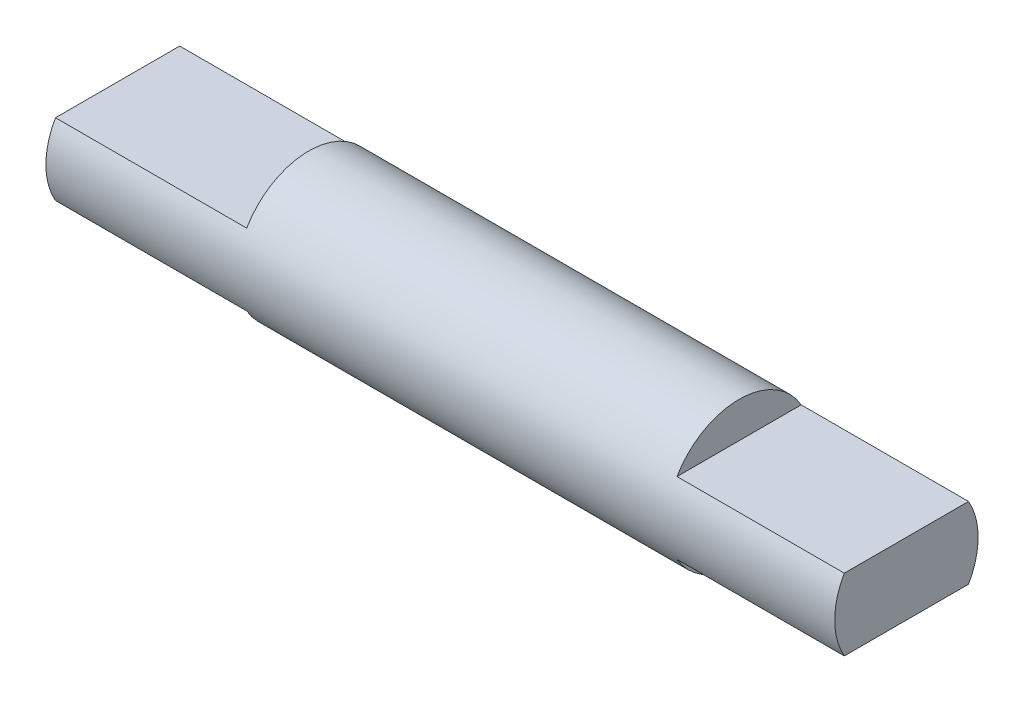
ISO-10303-21;
HEADER;
FILE_DESCRIPTION(('STEP AP214'),'2;1');
FILE_NAME('part.step','',(''),(''),'','','');
FILE_SCHEMA(('AUTOMOTIVE_DESIGN { 1 0 10303 214 1 1 1 1 }'));
ENDSEC;
DATA;
#1=APPLICATION_CONTEXT('core data for automotive mechanical design processes');
#2=APPLICATION_PROTOCOL_DEFINITION('international standard','automotive_design',2000,#1);
#3=PRODUCT_CONTEXT('',#1,'mechanical');
#4=PRODUCT('Part','Part','',(#3));
#5=PRODUCT_RELATED_PRODUCT_CATEGORY('part','',(#4));
#6=PRODUCT_DEFINITION_FORMATION('','',#4);
#7=PRODUCT_DEFINITION_CONTEXT('part definition',#1,'design');
#8=PRODUCT_DEFINITION('design','',#6,#7);
#9=PRODUCT_DEFINITION_SHAPE('','',#8);
#10=(LENGTH_UNIT() NAMED_UNIT(*) SI_UNIT(.MILLI.,.METRE.));
#11=(NAMED_UNIT(*) PLANE_ANGLE_UNIT() SI_UNIT($,.RADIAN.));
#12=(NAMED_UNIT(*) SI_UNIT($,.STERADIAN.) SOLID_ANGLE_UNIT());
#13=UNCERTAINTY_MEASURE_WITH_UNIT(LENGTH_MEASURE(1.E-05),#10,'distance_accuracy_value','');
#14=(GEOMETRIC_REPRESENTATION_CONTEXT(3) GLOBAL_UNCERTAINTY_ASSIGNED_CONTEXT((#13)) GLOBAL_UNIT_ASSIGNED_CONTEXT((#10,
#11,#12)) REPRESENTATION_CONTEXT('',''));
#15=CARTESIAN_POINT('',(0.,0.,0.));
#16=DIRECTION('',(0.,0.,1.));
#17=DIRECTION('',(1.,0.,0.));
#18=AXIS2_PLACEMENT_3D('',#15,#16,#17);
#19=CARTESIAN_POINT('',(33.,0.,0.));
#20=DIRECTION('',(-1.,0.,0.));
#21=DIRECTION('',(0.,0.,1.));
#22=AXIS2_PLACEMENT_3D('',#19,#20,#21);
#23=CYLINDRICAL_SURFACE('',#22,3.);
#24=CARTESIAN_POINT('',(33.,0.,0.));
#25=DIRECTION('',(1.,0.,0.));
#26=DIRECTION('',(0.,0.,-1.));
#27=AXIS2_PLACEMENT_3D('',#24,#25,#26);
#28=CIRCLE('',#27,3.);
#29=CARTESIAN_POINT('',(33.,-1.5,-2.59807621135332));
#30=VERTEX_POINT('',#29);
#31=CARTESIAN_POINT('',(33.,1.5,-2.59807621135332));
#32=VERTEX_POINT('',#31);
#33=EDGE_CURVE('E47',#30,#32,#28,.T.);
#34=ORIENTED_EDGE('',*,*,#33,.F.);
#35=DIRECTION('',(1.,0.,0.));
#36=VECTOR('',#35,1.);
#37=CARTESIAN_POINT('',(26.,-1.5,-2.59807621135332));
#38=LINE('',#37,#36);
#39=CARTESIAN_POINT('',(26.,-1.5,-2.59807621135332));
#40=VERTEX_POINT('',#39);
#41=EDGE_CURVE('E54',#40,#30,#38,.T.);
#42=ORIENTED_EDGE('',*,*,#41,.F.);
#43=CARTESIAN_POINT('',(26.,0.,0.));
#44=DIRECTION('',(1.,0.,0.));
#45=DIRECTION('',(0.,0.,-1.));
#46=AXIS2_PLACEMENT_3D('',#43,#44,#45);
#47=CIRCLE('',#46,3.);
#48=CARTESIAN_POINT('',(26.,-1.5,2.59807621135332));
#49=VERTEX_POINT('',#48);
#50=EDGE_CURVE('E106',#49,#40,#47,.T.);
#51=ORIENTED_EDGE('',*,*,#50,.F.);
#52=DIRECTION('',(1.,0.,0.));
#53=VECTOR('',#52,1.);
#54=CARTESIAN_POINT('',(26.,-1.5,2.59807621135332));
#55=LINE('',#54,#53);
#56=CARTESIAN_POINT('',(33.,-1.5,2.59807621135332));
#57=VERTEX_POINT('',#56);
#58=EDGE_CURVE('E114',#49,#57,#55,.T.);
#59=ORIENTED_EDGE('',*,*,#58,.T.);
#60=CARTESIAN_POINT('',(33.,1.5,2.59807621135332));
#61=VERTEX_POINT('',#60);
#62=EDGE_CURVE('E11',#61,#57,#28,.T.);
#63=ORIENTED_EDGE('',*,*,#62,.F.);
#64=DIRECTION('',(1.,0.,0.));
#65=VECTOR('',#64,1.);
#66=CARTESIAN_POINT('',(26.,1.5,2.59807621135332));
#67=LINE('',#66,#65);
#68=CARTESIAN_POINT('',(26.,1.5,2.59807621135332));
#69=VERTEX_POINT('',#68);
#70=EDGE_CURVE('E62',#69,#61,#67,.T.);
#71=ORIENTED_EDGE('',*,*,#70,.F.);
#72=CARTESIAN_POINT('',(26.,0.,0.));
#73=DIRECTION('',(1.,0.,0.));
#74=DIRECTION('',(0.,0.,-1.));
#75=AXIS2_PLACEMENT_3D('',#72,#73,#74);
#76=CIRCLE('',#75,3.);
#77=CARTESIAN_POINT('',(26.,1.5,-2.59807621135332));
#78=VERTEX_POINT('',#77);
#79=EDGE_CURVE('E125',#78,#69,#76,.T.);
#80=ORIENTED_EDGE('',*,*,#79,.F.);
#81=DIRECTION('',(1.,0.,0.));
#82=VECTOR('',#81,1.);
#83=CARTESIAN_POINT('',(26.,1.5,-2.59807621135332));
#84=LINE('',#83,#82);
#85=EDGE_CURVE('E132',#78,#32,#84,.T.);
#86=ORIENTED_EDGE('',*,*,#85,.T.);
#87=EDGE_LOOP('',(#34,#42,#51,#59,#63,#71,#80,#86));
#88=FACE_BOUND('',#87,.T.);
#89=CARTESIAN_POINT('',(8.,0.,0.));
#90=DIRECTION('',(-1.,0.,0.));
#91=DIRECTION('',(0.,0.,1.));
#92=AXIS2_PLACEMENT_3D('',#89,#90,#91);
#93=CIRCLE('',#92,3.);
#94=CARTESIAN_POINT('',(8.,-1.5,-2.59807621135332));
#95=VERTEX_POINT('',#94);
#96=CARTESIAN_POINT('',(8.,-1.5,2.59807621135332));
#97=VERTEX_POINT('',#96);
#98=EDGE_CURVE('E135',#95,#97,#93,.T.);
#99=ORIENTED_EDGE('',*,*,#98,.F.);
#100=DIRECTION('',(-1.,0.,0.));
#101=VECTOR('',#100,1.);
#102=CARTESIAN_POINT('',(8.,-1.5,-2.59807621135332));
#103=LINE('',#102,#101);
#104=CARTESIAN_POINT('',(0.,-1.5,-2.59807621135332));
#105=VERTEX_POINT('',#104);
#106=EDGE_CURVE('E144',#95,#105,#103,.T.);
#107=ORIENTED_EDGE('',*,*,#106,.T.);
#108=CARTESIAN_POINT('',(0.,0.,0.));
#109=DIRECTION('',(1.,0.,0.));
#110=DIRECTION('',(0.,0.,-1.));
#111=AXIS2_PLACEMENT_3D('',#108,#109,#110);
#112=CIRCLE('',#111,3.);
#113=CARTESIAN_POINT('',(0.,1.5,-2.59807621135332));
#114=VERTEX_POINT('',#113);
#115=EDGE_CURVE('E42',#105,#114,#112,.T.);
#116=ORIENTED_EDGE('',*,*,#115,.T.);
#117=DIRECTION('',(-1.,0.,0.));
#118=VECTOR('',#117,1.);
#119=CARTESIAN_POINT('',(8.,1.5,-2.59807621135332));
#120=LINE('',#119,#118);
#121=CARTESIAN_POINT('',(8.,1.5,-2.59807621135332));
#122=VERTEX_POINT('',#121);
#123=EDGE_CURVE('E153',#122,#114,#120,.T.);
#124=ORIENTED_EDGE('',*,*,#123,.F.);
#125=CARTESIAN_POINT('',(8.,0.,0.));
#126=DIRECTION('',(-1.,0.,0.));
#127=DIRECTION('',(0.,0.,1.));
#128=AXIS2_PLACEMENT_3D('',#125,#126,#127);
#129=CIRCLE('',#128,3.);
#130=CARTESIAN_POINT('',(8.,1.5,2.59807621135332));
#131=VERTEX_POINT('',#130);
#132=EDGE_CURVE('E148',#131,#122,#129,.T.);
#133=ORIENTED_EDGE('',*,*,#132,.F.);
#134=DIRECTION('',(-1.,0.,0.));
#135=VECTOR('',#134,1.);
#136=CARTESIAN_POINT('',(8.,1.5,2.59807621135332));
#137=LINE('',#136,#135);
#138=CARTESIAN_POINT('',(0.,1.5,2.59807621135332));
#139=VERTEX_POINT('',#138);
#140=EDGE_CURVE('E143',#131,#139,#137,.T.);
#141=ORIENTED_EDGE('',*,*,#140,.T.);
#142=CARTESIAN_POINT('',(0.,-1.5,2.59807621135332));
#143=VERTEX_POINT('',#142);
#144=EDGE_CURVE('E157',#139,#143,#112,.T.);
#145=ORIENTED_EDGE('',*,*,#144,.T.);
#146=DIRECTION('',(-1.,0.,0.));
#147=VECTOR('',#146,1.);
#148=CARTESIAN_POINT('',(8.,-1.5,2.59807621135332));
#149=LINE('',#148,#147);
#150=EDGE_CURVE('E141',#97,#143,#149,.T.);
#151=ORIENTED_EDGE('',*,*,#150,.F.);
#152=EDGE_LOOP('',(#99,#107,#116,#124,#133,#141,#145,#151));
#153=FACE_BOUND('',#152,.T.);
#154=ADVANCED_FACE('F39',(#88,#153),#23,.T.);
#155=CARTESIAN_POINT('',(33.,0.,0.));
#156=DIRECTION('',(1.,0.,0.));
#157=DIRECTION('',(0.,0.,-1.));
#158=AXIS2_PLACEMENT_3D('',#155,#156,#157);
#159=PLANE('',#158);
#160=DIRECTION('',(0.,0.,1.));
#161=VECTOR('',#160,1.);
#162=CARTESIAN_POINT('',(33.,-1.5,2.59807621135332));
#163=LINE('',#162,#161);
#164=EDGE_CURVE('E111',#30,#57,#163,.T.);
#165=ORIENTED_EDGE('',*,*,#164,.F.);
#166=ORIENTED_EDGE('',*,*,#33,.T.);
#167=DIRECTION('',(0.,0.,-1.));
#168=VECTOR('',#167,1.);
#169=CARTESIAN_POINT('',(33.,1.5,2.59807621135332));
#170=LINE('',#169,#168);
#171=EDGE_CURVE('E128',#61,#32,#170,.T.);
#172=ORIENTED_EDGE('',*,*,#171,.F.);
#173=ORIENTED_EDGE('',*,*,#62,.T.);
#174=EDGE_LOOP('',(#165,#166,#172,#173));
#175=FACE_BOUND('',#174,.T.);
#176=ADVANCED_FACE('F188',(#175),#159,.T.);
#177=CARTESIAN_POINT('',(0.,0.,0.));
#178=DIRECTION('',(1.,0.,0.));
#179=DIRECTION('',(0.,0.,-1.));
#180=AXIS2_PLACEMENT_3D('',#177,#178,#179);
#181=PLANE('',#180);
#182=ORIENTED_EDGE('',*,*,#115,.F.);
#183=DIRECTION('',(0.,0.,-1.));
#184=VECTOR('',#183,1.);
#185=CARTESIAN_POINT('',(0.,-1.5,-2.59807621135332));
#186=LINE('',#185,#184);
#187=EDGE_CURVE('E138',#143,#105,#186,.T.);
#188=ORIENTED_EDGE('',*,*,#187,.F.);
#189=ORIENTED_EDGE('',*,*,#144,.F.);
#190=DIRECTION('',(0.,0.,1.));
#191=VECTOR('',#190,1.);
#192=CARTESIAN_POINT('',(0.,1.5,-2.59807621135332));
#193=LINE('',#192,#191);
#194=EDGE_CURVE('E121',#114,#139,#193,.T.);
#195=ORIENTED_EDGE('',*,*,#194,.F.);
#196=EDGE_LOOP('',(#182,#188,#189,#195));
#197=FACE_BOUND('',#196,.T.);
#198=ADVANCED_FACE('F170',(#197),#181,.F.);
#199=CARTESIAN_POINT('',(8.,1.5,-2.59807621135332));
#200=DIRECTION('',(0.,-1.,0.));
#201=DIRECTION('',(0.,0.,-1.));
#202=AXIS2_PLACEMENT_3D('',#199,#200,#201);
#203=PLANE('',#202);
#204=ORIENTED_EDGE('',*,*,#194,.T.);
#205=ORIENTED_EDGE('',*,*,#140,.F.);
#206=DIRECTION('',(0.,0.,1.));
#207=VECTOR('',#206,1.);
#208=CARTESIAN_POINT('',(8.,1.5,-2.59807621135332));
#209=LINE('',#208,#207);
#210=EDGE_CURVE('E150',#122,#131,#209,.T.);
#211=ORIENTED_EDGE('',*,*,#210,.F.);
#212=ORIENTED_EDGE('',*,*,#123,.T.);
#213=EDGE_LOOP('',(#204,#205,#211,#212));
#214=FACE_BOUND('',#213,.T.);
#215=ADVANCED_FACE('F172',(#214),#203,.F.);
#216=CARTESIAN_POINT('',(8.,0.,0.));
#217=DIRECTION('',(-1.,0.,0.));
#218=DIRECTION('',(0.,0.,1.));
#219=AXIS2_PLACEMENT_3D('',#216,#217,#218);
#220=PLANE('',#219);
#221=ORIENTED_EDGE('',*,*,#132,.T.);
#222=ORIENTED_EDGE('',*,*,#210,.T.);
#223=EDGE_LOOP('',(#221,#222));
#224=FACE_BOUND('',#223,.T.);
#225=ADVANCED_FACE('F175',(#224),#220,.T.);
#226=CARTESIAN_POINT('',(8.,-1.5,-2.59807621135332));
#227=DIRECTION('',(0.,1.,0.));
#228=DIRECTION('',(0.,0.,1.));
#229=AXIS2_PLACEMENT_3D('',#226,#227,#228);
#230=PLANE('',#229);
#231=ORIENTED_EDGE('',*,*,#187,.T.);
#232=ORIENTED_EDGE('',*,*,#106,.F.);
#233=DIRECTION('',(0.,0.,-1.));
#234=VECTOR('',#233,1.);
#235=CARTESIAN_POINT('',(8.,-1.5,-2.59807621135332));
#236=LINE('',#235,#234);
#237=EDGE_CURVE('E137',#97,#95,#236,.T.);
#238=ORIENTED_EDGE('',*,*,#237,.F.);
#239=ORIENTED_EDGE('',*,*,#150,.T.);
#240=EDGE_LOOP('',(#231,#232,#238,#239));
#241=FACE_BOUND('',#240,.T.);
#242=ADVANCED_FACE('F177',(#241),#230,.F.);
#243=CARTESIAN_POINT('',(8.,0.,0.));
#244=DIRECTION('',(-1.,0.,0.));
#245=DIRECTION('',(0.,0.,1.));
#246=AXIS2_PLACEMENT_3D('',#243,#244,#245);
#247=PLANE('',#246);
#248=ORIENTED_EDGE('',*,*,#98,.T.);
#249=ORIENTED_EDGE('',*,*,#237,.T.);
#250=EDGE_LOOP('',(#248,#249));
#251=FACE_BOUND('',#250,.T.);
#252=ADVANCED_FACE('F183',(#251),#247,.T.);
#253=CARTESIAN_POINT('',(26.,1.5,2.59807621135332));
#254=DIRECTION('',(0.,-1.,0.));
#255=DIRECTION('',(0.,0.,-1.));
#256=AXIS2_PLACEMENT_3D('',#253,#254,#255);
#257=PLANE('',#256);
#258=ORIENTED_EDGE('',*,*,#171,.T.);
#259=ORIENTED_EDGE('',*,*,#85,.F.);
#260=DIRECTION('',(0.,0.,-1.));
#261=VECTOR('',#260,1.);
#262=CARTESIAN_POINT('',(26.,1.5,2.59807621135332));
#263=LINE('',#262,#261);
#264=EDGE_CURVE('E127',#69,#78,#263,.T.);
#265=ORIENTED_EDGE('',*,*,#264,.F.);
#266=ORIENTED_EDGE('',*,*,#70,.T.);
#267=EDGE_LOOP('',(#258,#259,#265,#266));
#268=FACE_BOUND('',#267,.T.);
#269=ADVANCED_FACE('F200',(#268),#257,.F.);
#270=CARTESIAN_POINT('',(26.,0.,0.));
#271=DIRECTION('',(1.,0.,0.));
#272=DIRECTION('',(0.,0.,-1.));
#273=AXIS2_PLACEMENT_3D('',#270,#271,#272);
#274=PLANE('',#273);
#275=ORIENTED_EDGE('',*,*,#79,.T.);
#276=ORIENTED_EDGE('',*,*,#264,.T.);
#277=EDGE_LOOP('',(#275,#276));
#278=FACE_BOUND('',#277,.T.);
#279=ADVANCED_FACE('F199',(#278),#274,.T.);
#280=CARTESIAN_POINT('',(26.,-1.5,2.59807621135332));
#281=DIRECTION('',(0.,1.,0.));
#282=DIRECTION('',(0.,0.,1.));
#283=AXIS2_PLACEMENT_3D('',#280,#281,#282);
#284=PLANE('',#283);
#285=ORIENTED_EDGE('',*,*,#164,.T.);
#286=ORIENTED_EDGE('',*,*,#58,.F.);
#287=DIRECTION('',(0.,0.,1.));
#288=VECTOR('',#287,1.);
#289=CARTESIAN_POINT('',(26.,-1.5,2.59807621135332));
#290=LINE('',#289,#288);
#291=EDGE_CURVE('E108',#40,#49,#290,.T.);
#292=ORIENTED_EDGE('',*,*,#291,.F.);
#293=ORIENTED_EDGE('',*,*,#41,.T.);
#294=EDGE_LOOP('',(#285,#286,#292,#293));
#295=FACE_BOUND('',#294,.T.);
#296=ADVANCED_FACE('F113',(#295),#284,.F.);
#297=CARTESIAN_POINT('',(26.,0.,0.));
#298=DIRECTION('',(1.,0.,0.));
#299=DIRECTION('',(0.,0.,-1.));
#300=AXIS2_PLACEMENT_3D('',#297,#298,#299);
#301=PLANE('',#300);
#302=ORIENTED_EDGE('',*,*,#50,.T.);
#303=ORIENTED_EDGE('',*,*,#291,.T.);
#304=EDGE_LOOP('',(#302,#303));
#305=FACE_BOUND('',#304,.T.);
#306=ADVANCED_FACE('F107',(#305),#301,.T.);
#307=CLOSED_SHELL('',(#154,#176,#198,#215,#225,#242,#252,#269,#279,#296,#306));
#308=MANIFOLD_SOLID_BREP('B2',#307);
#309=ADVANCED_BREP_SHAPE_REPRESENTATION('',(#18,#308),#14);
#310=SHAPE_DEFINITION_REPRESENTATION(#9,#309);
ENDSEC;
END-ISO-10303-21;
